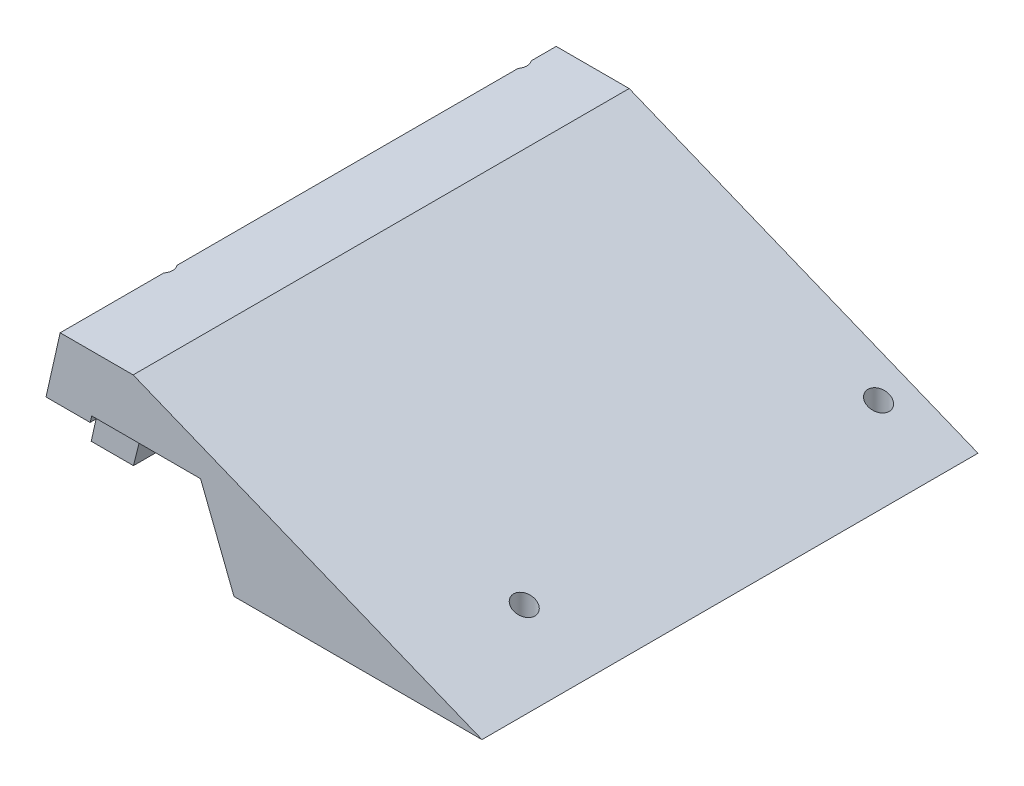
ISO-10303-21;
HEADER;
FILE_DESCRIPTION(('STEP AP214'),'2;1');
FILE_NAME('part.step','',(''),(''),'','','');
FILE_SCHEMA(('AUTOMOTIVE_DESIGN { 1 0 10303 214 1 1 1 1 }'));
ENDSEC;
DATA;
#1=APPLICATION_CONTEXT('core data for automotive mechanical design processes');
#2=APPLICATION_PROTOCOL_DEFINITION('international standard','automotive_design',2000,#1);
#3=PRODUCT_CONTEXT('',#1,'mechanical');
#4=PRODUCT('Part','Part','',(#3));
#5=PRODUCT_RELATED_PRODUCT_CATEGORY('part','',(#4));
#6=PRODUCT_DEFINITION_FORMATION('','',#4);
#7=PRODUCT_DEFINITION_CONTEXT('part definition',#1,'design');
#8=PRODUCT_DEFINITION('design','',#6,#7);
#9=PRODUCT_DEFINITION_SHAPE('','',#8);
#10=(LENGTH_UNIT() NAMED_UNIT(*) SI_UNIT(.MILLI.,.METRE.));
#11=(NAMED_UNIT(*) PLANE_ANGLE_UNIT() SI_UNIT($,.RADIAN.));
#12=(NAMED_UNIT(*) SI_UNIT($,.STERADIAN.) SOLID_ANGLE_UNIT());
#13=UNCERTAINTY_MEASURE_WITH_UNIT(LENGTH_MEASURE(1.E-05),#10,'distance_accuracy_value','');
#14=(GEOMETRIC_REPRESENTATION_CONTEXT(3) GLOBAL_UNCERTAINTY_ASSIGNED_CONTEXT((#13)) GLOBAL_UNIT_ASSIGNED_CONTEXT((#10,
#11,#12)) REPRESENTATION_CONTEXT('',''));
#15=CARTESIAN_POINT('',(0.,0.,0.));
#16=DIRECTION('',(0.,0.,1.));
#17=DIRECTION('',(1.,0.,0.));
#18=AXIS2_PLACEMENT_3D('',#15,#16,#17);
#19=CARTESIAN_POINT('',(13.4332721150903,10.8252450173548,63.));
#20=DIRECTION('',(-0.970371375639122,0.241618280227795,0.));
#21=DIRECTION('',(-0.241618280227795,-0.970371375639122,0.));
#22=AXIS2_PLACEMENT_3D('',#19,#20,#21);
#23=PLANE('',#22);
#24=DIRECTION('',(0.241618280227795,0.970371375639122,0.));
#25=VECTOR('',#24,1.);
#26=CARTESIAN_POINT('',(13.4332721150903,10.8252450173548,55.));
#27=LINE('',#26,#25);
#28=CARTESIAN_POINT('',(10.7378328741965,0.,55.));
#29=VERTEX_POINT('',#28);
#30=CARTESIAN_POINT('',(13.2277896710843,10.,55.));
#31=VERTEX_POINT('',#30);
#32=EDGE_CURVE('E200',#29,#31,#27,.T.);
#33=ORIENTED_EDGE('',*,*,#32,.F.);
#34=DIRECTION('',(0.,0.,-1.));
#35=VECTOR('',#34,1.);
#36=CARTESIAN_POINT('',(10.7378328741965,0.,63.));
#37=LINE('',#36,#35);
#38=CARTESIAN_POINT('',(10.7378328741965,0.,6.));
#39=VERTEX_POINT('',#38);
#40=EDGE_CURVE('E153',#29,#39,#37,.T.);
#41=ORIENTED_EDGE('',*,*,#40,.T.);
#42=DIRECTION('',(0.241618280227795,0.970371375639122,0.));
#43=VECTOR('',#42,1.);
#44=CARTESIAN_POINT('',(13.4332721150903,10.8252450173548,6.));
#45=LINE('',#44,#43);
#46=CARTESIAN_POINT('',(13.4332721150903,10.8252450173548,6.));
#47=VERTEX_POINT('',#46);
#48=EDGE_CURVE('E205',#39,#47,#45,.T.);
#49=ORIENTED_EDGE('',*,*,#48,.T.);
#50=DIRECTION('',(0.,0.,-1.));
#51=VECTOR('',#50,1.);
#52=CARTESIAN_POINT('',(13.4332721150903,10.8252450173548,63.));
#53=LINE('',#52,#51);
#54=CARTESIAN_POINT('',(13.4332721150903,10.8252450173548,63.));
#55=VERTEX_POINT('',#54);
#56=EDGE_CURVE('E229',#55,#47,#53,.T.);
#57=ORIENTED_EDGE('',*,*,#56,.F.);
#58=DIRECTION('',(0.241618280227795,0.970371375639122,0.));
#59=VECTOR('',#58,1.);
#60=CARTESIAN_POINT('',(13.4332721150903,10.8252450173548,63.));
#61=LINE('',#60,#59);
#62=CARTESIAN_POINT('',(13.2277896710843,10.,63.));
#63=VERTEX_POINT('',#62);
#64=EDGE_CURVE('E227',#63,#55,#61,.T.);
#65=ORIENTED_EDGE('',*,*,#64,.F.);
#66=DIRECTION('',(0.,0.,1.));
#67=VECTOR('',#66,1.);
#68=CARTESIAN_POINT('',(13.2277896710843,10.,63.));
#69=LINE('',#68,#67);
#70=EDGE_CURVE('E196',#31,#63,#69,.T.);
#71=ORIENTED_EDGE('',*,*,#70,.F.);
#72=EDGE_LOOP('',(#33,#41,#49,#57,#65,#71));
#73=FACE_BOUND('',#72,.T.);
#74=ADVANCED_FACE('F44',(#73),#23,.F.);
#75=CARTESIAN_POINT('',(9.42653810835628,17.9645165202627,63.));
#76=DIRECTION('',(0.975427958578046,-0.220318627501776,0.));
#77=DIRECTION('',(0.220318627501776,0.975427958578046,0.));
#78=AXIS2_PLACEMENT_3D('',#75,#76,#77);
#79=PLANE('',#78);
#80=DIRECTION('',(0.,0.,-1.));
#81=VECTOR('',#80,1.);
#82=CARTESIAN_POINT('',(9.42653810835628,17.9645165202627,63.));
#83=LINE('',#82,#81);
#84=CARTESIAN_POINT('',(9.42653810835628,17.9645165202627,48.1609908221686));
#85=VERTEX_POINT('',#84);
#86=CARTESIAN_POINT('',(9.42653810835628,17.9645165202627,4.83900917783143));
#87=VERTEX_POINT('',#86);
#88=EDGE_CURVE('E141',#85,#87,#83,.T.);
#89=ORIENTED_EDGE('',*,*,#88,.T.);
#90=CARTESIAN_POINT('',(8.36891643709825,13.2820538549812,4.));
#91=DIRECTION('',(0.975427958578046,-0.220318627501776,0.));
#92=DIRECTION('',(-0.220318627501776,-0.975427958578046,0.));
#93=AXIS2_PLACEMENT_3D('',#90,#91,#92);
#94=ELLIPSE('',#93,6.12748915199699,1.35);
#95=CARTESIAN_POINT('',(9.42653810835628,17.9645165202627,3.16099082216857));
#96=VERTEX_POINT('',#95);
#97=EDGE_CURVE('E60',#87,#96,#94,.T.);
#98=ORIENTED_EDGE('',*,*,#97,.T.);
#99=CARTESIAN_POINT('',(9.42653810835628,17.9645165202627,0.));
#100=VERTEX_POINT('',#99);
#101=EDGE_CURVE('E139',#96,#100,#83,.T.);
#102=ORIENTED_EDGE('',*,*,#101,.T.);
#103=DIRECTION('',(-0.220318627501776,-0.975427958578046,0.));
#104=VECTOR('',#103,1.);
#105=CARTESIAN_POINT('',(9.42653810835628,17.9645165202627,0.));
#106=LINE('',#105,#104);
#107=CARTESIAN_POINT('',(5.36891643709825,0.,0.));
#108=VERTEX_POINT('',#107);
#109=EDGE_CURVE('E232',#100,#108,#106,.T.);
#110=ORIENTED_EDGE('',*,*,#109,.T.);
#111=DIRECTION('',(0.,0.,-1.));
#112=VECTOR('',#111,1.);
#113=CARTESIAN_POINT('',(5.36891643709825,0.,63.));
#114=LINE('',#113,#112);
#115=CARTESIAN_POINT('',(5.36891643709825,0.,55.));
#116=VERTEX_POINT('',#115);
#117=EDGE_CURVE('E150',#116,#108,#114,.T.);
#118=ORIENTED_EDGE('',*,*,#117,.F.);
#119=DIRECTION('',(-0.220318627501776,-0.975427958578046,0.));
#120=VECTOR('',#119,1.);
#121=CARTESIAN_POINT('',(9.42653810835628,17.9645165202627,55.));
#122=LINE('',#121,#120);
#123=CARTESIAN_POINT('',(7.62760325824444,10.,55.));
#124=VERTEX_POINT('',#123);
#125=EDGE_CURVE('E198',#124,#116,#122,.T.);
#126=ORIENTED_EDGE('',*,*,#125,.F.);
#127=DIRECTION('',(0.,0.,-1.));
#128=VECTOR('',#127,1.);
#129=CARTESIAN_POINT('',(7.62760325824444,10.,63.));
#130=LINE('',#129,#128);
#131=CARTESIAN_POINT('',(7.62760325824444,10.,63.));
#132=VERTEX_POINT('',#131);
#133=EDGE_CURVE('E194',#132,#124,#130,.T.);
#134=ORIENTED_EDGE('',*,*,#133,.F.);
#135=DIRECTION('',(-0.220318627501776,-0.975427958578046,0.));
#136=VECTOR('',#135,1.);
#137=CARTESIAN_POINT('',(9.42653810835628,17.9645165202627,63.));
#138=LINE('',#137,#136);
#139=CARTESIAN_POINT('',(9.42653810835628,17.9645165202627,63.));
#140=VERTEX_POINT('',#139);
#141=EDGE_CURVE('E224',#140,#132,#138,.T.);
#142=ORIENTED_EDGE('',*,*,#141,.F.);
#143=CARTESIAN_POINT('',(9.42653810835628,17.9645165202627,49.8390091778314));
#144=VERTEX_POINT('',#143);
#145=EDGE_CURVE('E152',#140,#144,#83,.T.);
#146=ORIENTED_EDGE('',*,*,#145,.T.);
#147=CARTESIAN_POINT('',(8.36891643709825,13.2820538549812,49.));
#148=DIRECTION('',(0.975427958578046,-0.220318627501776,0.));
#149=DIRECTION('',(-0.220318627501776,-0.975427958578046,0.));
#150=AXIS2_PLACEMENT_3D('',#147,#148,#149);
#151=ELLIPSE('',#150,6.12748915199699,1.35);
#152=EDGE_CURVE('E66',#144,#85,#151,.T.);
#153=ORIENTED_EDGE('',*,*,#152,.T.);
#154=EDGE_LOOP('',(#89,#98,#102,#110,#118,#126,#134,#142,#146,#153));
#155=FACE_BOUND('',#154,.T.);
#156=ADVANCED_FACE('F137',(#155),#79,.F.);
#157=CARTESIAN_POINT('',(5.36891643709825,0.,63.));
#158=DIRECTION('',(0.,1.,0.));
#159=DIRECTION('',(0.,0.,1.));
#160=AXIS2_PLACEMENT_3D('',#157,#158,#159);
#161=PLANE('',#160);
#162=CARTESIAN_POINT('',(54.3689164370982,0.,49.));
#163=DIRECTION('',(0.,-1.,0.));
#164=DIRECTION('',(0.,0.,-1.));
#165=AXIS2_PLACEMENT_3D('',#162,#163,#164);
#166=CIRCLE('',#165,1.35);
#167=CARTESIAN_POINT('',(54.3689164370982,0.,47.65));
#168=VERTEX_POINT('',#167);
#169=EDGE_CURVE('E143',#168,#168,#166,.T.);
#170=ORIENTED_EDGE('',*,*,#169,.F.);
#171=EDGE_LOOP('',(#170));
#172=FACE_BOUND('',#171,.T.);
#173=CARTESIAN_POINT('',(54.3689164370982,0.,4.));
#174=DIRECTION('',(0.,-1.,0.));
#175=DIRECTION('',(0.,0.,-1.));
#176=AXIS2_PLACEMENT_3D('',#173,#174,#175);
#177=CIRCLE('',#176,1.35);
#178=CARTESIAN_POINT('',(54.3689164370982,0.,2.65));
#179=VERTEX_POINT('',#178);
#180=EDGE_CURVE('E388',#179,#179,#177,.T.);
#181=ORIENTED_EDGE('',*,*,#180,.F.);
#182=EDGE_LOOP('',(#181));
#183=FACE_BOUND('',#182,.T.);
#184=CARTESIAN_POINT('',(8.36891643709825,0.,4.));
#185=DIRECTION('',(0.,-1.,0.));
#186=DIRECTION('',(0.,0.,-1.));
#187=AXIS2_PLACEMENT_3D('',#184,#185,#186);
#188=CIRCLE('',#187,1.35);
#189=CARTESIAN_POINT('',(8.36891643709825,0.,2.65));
#190=VERTEX_POINT('',#189);
#191=EDGE_CURVE('E391',#190,#190,#188,.T.);
#192=ORIENTED_EDGE('',*,*,#191,.F.);
#193=EDGE_LOOP('',(#192));
#194=FACE_BOUND('',#193,.T.);
#195=CARTESIAN_POINT('',(8.36891643709825,0.,49.));
#196=DIRECTION('',(0.,-1.,0.));
#197=DIRECTION('',(0.,0.,-1.));
#198=AXIS2_PLACEMENT_3D('',#195,#196,#197);
#199=CIRCLE('',#198,1.35);
#200=CARTESIAN_POINT('',(8.36891643709825,0.,47.65));
#201=VERTEX_POINT('',#200);
#202=EDGE_CURVE('E178',#201,#201,#199,.T.);
#203=ORIENTED_EDGE('',*,*,#202,.F.);
#204=EDGE_LOOP('',(#203));
#205=FACE_BOUND('',#204,.T.);
#206=DIRECTION('',(-1.,0.,0.));
#207=VECTOR('',#206,1.);
#208=CARTESIAN_POINT('',(17.,0.,55.));
#209=LINE('',#208,#207);
#210=EDGE_CURVE('E191',#29,#116,#209,.T.);
#211=ORIENTED_EDGE('',*,*,#210,.T.);
#212=ORIENTED_EDGE('',*,*,#117,.T.);
#213=DIRECTION('',(1.,0.,0.));
#214=VECTOR('',#213,1.);
#215=CARTESIAN_POINT('',(5.36891643709825,0.,0.));
#216=LINE('',#215,#214);
#217=CARTESIAN_POINT('',(63.,0.,0.));
#218=VERTEX_POINT('',#217);
#219=EDGE_CURVE('E216',#108,#218,#216,.T.);
#220=ORIENTED_EDGE('',*,*,#219,.T.);
#221=DIRECTION('',(0.,0.,-1.));
#222=VECTOR('',#221,1.);
#223=CARTESIAN_POINT('',(63.,0.,63.));
#224=LINE('',#223,#222);
#225=CARTESIAN_POINT('',(63.,0.,63.));
#226=VERTEX_POINT('',#225);
#227=EDGE_CURVE('E160',#226,#218,#224,.T.);
#228=ORIENTED_EDGE('',*,*,#227,.F.);
#229=DIRECTION('',(1.,0.,0.));
#230=VECTOR('',#229,1.);
#231=CARTESIAN_POINT('',(31.5,0.,63.));
#232=LINE('',#231,#230);
#233=CARTESIAN_POINT('',(31.5,0.,63.));
#234=VERTEX_POINT('',#233);
#235=EDGE_CURVE('E218',#234,#226,#232,.T.);
#236=ORIENTED_EDGE('',*,*,#235,.F.);
#237=DIRECTION('',(0.,0.,-1.));
#238=VECTOR('',#237,1.);
#239=CARTESIAN_POINT('',(31.5,0.,63.));
#240=LINE('',#239,#238);
#241=CARTESIAN_POINT('',(31.5,0.,6.));
#242=VERTEX_POINT('',#241);
#243=EDGE_CURVE('E164',#234,#242,#240,.T.);
#244=ORIENTED_EDGE('',*,*,#243,.T.);
#245=DIRECTION('',(-1.,0.,0.));
#246=VECTOR('',#245,1.);
#247=CARTESIAN_POINT('',(10.7378328741965,0.,6.));
#248=LINE('',#247,#246);
#249=EDGE_CURVE('E202',#242,#39,#248,.T.);
#250=ORIENTED_EDGE('',*,*,#249,.T.);
#251=ORIENTED_EDGE('',*,*,#40,.F.);
#252=EDGE_LOOP('',(#211,#212,#220,#228,#236,#244,#250,#251));
#253=FACE_BOUND('',#252,.T.);
#254=ADVANCED_FACE('F249',(#172,#183,#194,#205,#253),#161,.F.);
#255=CARTESIAN_POINT('',(0.,0.,63.));
#256=DIRECTION('',(0.,0.,-1.));
#257=DIRECTION('',(-1.,0.,0.));
#258=AXIS2_PLACEMENT_3D('',#255,#256,#257);
#259=PLANE('',#258);
#260=DIRECTION('',(-1.,0.,0.));
#261=VECTOR('',#260,1.);
#262=CARTESIAN_POINT('',(0.,10.,63.));
#263=LINE('',#262,#261);
#264=EDGE_CURVE('E172',#63,#132,#263,.T.);
#265=ORIENTED_EDGE('',*,*,#264,.F.);
#266=ORIENTED_EDGE('',*,*,#64,.T.);
#267=DIRECTION('',(1.,0.,0.));
#268=VECTOR('',#267,1.);
#269=CARTESIAN_POINT('',(13.4332721150903,10.8252450173548,63.));
#270=LINE('',#269,#268);
#271=CARTESIAN_POINT('',(27.2620064049157,10.8252450173548,63.));
#272=VERTEX_POINT('',#271);
#273=EDGE_CURVE('E212',#55,#272,#270,.T.);
#274=ORIENTED_EDGE('',*,*,#273,.T.);
#275=DIRECTION('',(0.364550638650222,-0.93118356507174,0.));
#276=VECTOR('',#275,1.);
#277=CARTESIAN_POINT('',(27.2620064049157,10.8252450173548,63.));
#278=LINE('',#277,#276);
#279=EDGE_CURVE('E215',#272,#234,#278,.T.);
#280=ORIENTED_EDGE('',*,*,#279,.T.);
#281=ORIENTED_EDGE('',*,*,#235,.T.);
#282=DIRECTION('',(-0.926713780591244,0.375767972108166,0.));
#283=VECTOR('',#282,1.);
#284=CARTESIAN_POINT('',(63.,0.,63.));
#285=LINE('',#284,#283);
#286=CARTESIAN_POINT('',(18.6961575847282,17.9645165202627,63.));
#287=VERTEX_POINT('',#286);
#288=EDGE_CURVE('E220',#226,#287,#285,.T.);
#289=ORIENTED_EDGE('',*,*,#288,.T.);
#290=DIRECTION('',(-1.,0.,0.));
#291=VECTOR('',#290,1.);
#292=CARTESIAN_POINT('',(18.6961575847282,17.9645165202627,63.));
#293=LINE('',#292,#291);
#294=EDGE_CURVE('E222',#287,#140,#293,.T.);
#295=ORIENTED_EDGE('',*,*,#294,.T.);
#296=ORIENTED_EDGE('',*,*,#141,.T.);
#297=EDGE_LOOP('',(#265,#266,#274,#280,#281,#289,#295,#296));
#298=FACE_BOUND('',#297,.T.);
#299=ADVANCED_FACE('F261',(#298),#259,.F.);
#300=CARTESIAN_POINT('',(13.4332721150903,10.8252450173548,63.));
#301=DIRECTION('',(0.,1.,0.));
#302=DIRECTION('',(0.,0.,1.));
#303=AXIS2_PLACEMENT_3D('',#300,#301,#302);
#304=PLANE('',#303);
#305=DIRECTION('',(1.,0.,0.));
#306=VECTOR('',#305,1.);
#307=CARTESIAN_POINT('',(27.2620064049157,10.8252450173548,6.));
#308=LINE('',#307,#306);
#309=CARTESIAN_POINT('',(27.2620064049157,10.8252450173548,6.));
#310=VERTEX_POINT('',#309);
#311=EDGE_CURVE('E207',#47,#310,#308,.T.);
#312=ORIENTED_EDGE('',*,*,#311,.T.);
#313=DIRECTION('',(0.,0.,-1.));
#314=VECTOR('',#313,1.);
#315=CARTESIAN_POINT('',(27.2620064049157,10.8252450173548,63.));
#316=LINE('',#315,#314);
#317=EDGE_CURVE('E169',#272,#310,#316,.T.);
#318=ORIENTED_EDGE('',*,*,#317,.F.);
#319=ORIENTED_EDGE('',*,*,#273,.F.);
#320=ORIENTED_EDGE('',*,*,#56,.T.);
#321=EDGE_LOOP('',(#312,#318,#319,#320));
#322=FACE_BOUND('',#321,.T.);
#323=ADVANCED_FACE('F46',(#322),#304,.F.);
#324=CARTESIAN_POINT('',(27.2620064049157,10.8252450173548,63.));
#325=DIRECTION('',(0.93118356507174,0.364550638650222,0.));
#326=DIRECTION('',(-0.364550638650222,0.93118356507174,0.));
#327=AXIS2_PLACEMENT_3D('',#324,#325,#326);
#328=PLANE('',#327);
#329=DIRECTION('',(0.364550638650222,-0.93118356507174,0.));
#330=VECTOR('',#329,1.);
#331=CARTESIAN_POINT('',(31.5,0.,6.));
#332=LINE('',#331,#330);
#333=EDGE_CURVE('E209',#310,#242,#332,.T.);
#334=ORIENTED_EDGE('',*,*,#333,.T.);
#335=ORIENTED_EDGE('',*,*,#243,.F.);
#336=ORIENTED_EDGE('',*,*,#279,.F.);
#337=ORIENTED_EDGE('',*,*,#317,.T.);
#338=EDGE_LOOP('',(#334,#335,#336,#337));
#339=FACE_BOUND('',#338,.T.);
#340=ADVANCED_FACE('F254',(#339),#328,.F.);
#341=CARTESIAN_POINT('',(63.,0.,63.));
#342=DIRECTION('',(-0.375767972108166,-0.926713780591244,0.));
#343=DIRECTION('',(0.926713780591244,-0.375767972108166,0.));
#344=AXIS2_PLACEMENT_3D('',#341,#342,#343);
#345=PLANE('',#344);
#346=CARTESIAN_POINT('',(54.3689164370982,3.49976965429229,49.));
#347=DIRECTION('',(-0.375767972108166,-0.926713780591244,0.));
#348=DIRECTION('',(0.926713780591244,-0.375767972108166,0.));
#349=AXIS2_PLACEMENT_3D('',#346,#347,#348);
#350=ELLIPSE('',#349,1.45676046722721,1.35);
#351=CARTESIAN_POINT('',(55.7189164370982,2.95236572767498,49.));
#352=VERTEX_POINT('',#351);
#353=EDGE_CURVE('E48',#352,#352,#350,.T.);
#354=ORIENTED_EDGE('',*,*,#353,.T.);
#355=EDGE_LOOP('',(#354));
#356=FACE_BOUND('',#355,.T.);
#357=CARTESIAN_POINT('',(54.3689164370982,3.49976965429229,4.));
#358=DIRECTION('',(-0.375767972108166,-0.926713780591244,0.));
#359=DIRECTION('',(0.926713780591244,-0.375767972108166,0.));
#360=AXIS2_PLACEMENT_3D('',#357,#358,#359);
#361=ELLIPSE('',#360,1.45676046722721,1.35);
#362=CARTESIAN_POINT('',(55.7189164370982,2.95236572767498,4.));
#363=VERTEX_POINT('',#362);
#364=EDGE_CURVE('E142',#363,#363,#361,.T.);
#365=ORIENTED_EDGE('',*,*,#364,.T.);
#366=EDGE_LOOP('',(#365));
#367=FACE_BOUND('',#366,.T.);
#368=DIRECTION('',(-0.926713780591244,0.375767972108166,0.));
#369=VECTOR('',#368,1.);
#370=CARTESIAN_POINT('',(63.,0.,0.));
#371=LINE('',#370,#369);
#372=CARTESIAN_POINT('',(18.6961575847282,17.9645165202627,0.));
#373=VERTEX_POINT('',#372);
#374=EDGE_CURVE('E211',#218,#373,#371,.T.);
#375=ORIENTED_EDGE('',*,*,#374,.T.);
#376=DIRECTION('',(0.,0.,-1.));
#377=VECTOR('',#376,1.);
#378=CARTESIAN_POINT('',(18.6961575847282,17.9645165202627,63.));
#379=LINE('',#378,#377);
#380=EDGE_CURVE('E157',#287,#373,#379,.T.);
#381=ORIENTED_EDGE('',*,*,#380,.F.);
#382=ORIENTED_EDGE('',*,*,#288,.F.);
#383=ORIENTED_EDGE('',*,*,#227,.T.);
#384=EDGE_LOOP('',(#375,#381,#382,#383));
#385=FACE_BOUND('',#384,.T.);
#386=ADVANCED_FACE('F275',(#356,#367,#385),#345,.F.);
#387=CARTESIAN_POINT('',(18.6961575847282,17.9645165202627,63.));
#388=DIRECTION('',(0.,-1.,0.));
#389=DIRECTION('',(1.,0.,0.));
#390=AXIS2_PLACEMENT_3D('',#387,#388,#389);
#391=PLANE('',#390);
#392=ORIENTED_EDGE('',*,*,#101,.F.);
#393=CARTESIAN_POINT('',(8.36891643709825,17.9645165202627,4.));
#394=DIRECTION('',(0.,-1.,0.));
#395=DIRECTION('',(1.,0.,0.));
#396=AXIS2_PLACEMENT_3D('',#393,#394,#395);
#397=CIRCLE('',#396,1.35);
#398=EDGE_CURVE('E13',#96,#87,#397,.T.);
#399=ORIENTED_EDGE('',*,*,#398,.T.);
#400=ORIENTED_EDGE('',*,*,#88,.F.);
#401=CARTESIAN_POINT('',(8.36891643709825,17.9645165202627,49.));
#402=DIRECTION('',(0.,-1.,0.));
#403=DIRECTION('',(1.,0.,0.));
#404=AXIS2_PLACEMENT_3D('',#401,#402,#403);
#405=CIRCLE('',#404,1.35);
#406=EDGE_CURVE('E53',#85,#144,#405,.T.);
#407=ORIENTED_EDGE('',*,*,#406,.T.);
#408=ORIENTED_EDGE('',*,*,#145,.F.);
#409=ORIENTED_EDGE('',*,*,#294,.F.);
#410=ORIENTED_EDGE('',*,*,#380,.T.);
#411=DIRECTION('',(-1.,0.,0.));
#412=VECTOR('',#411,1.);
#413=CARTESIAN_POINT('',(18.6961575847282,17.9645165202627,0.));
#414=LINE('',#413,#412);
#415=EDGE_CURVE('E148',#373,#100,#414,.T.);
#416=ORIENTED_EDGE('',*,*,#415,.T.);
#417=EDGE_LOOP('',(#392,#399,#400,#407,#408,#409,#410,#416));
#418=FACE_BOUND('',#417,.T.);
#419=ADVANCED_FACE('F145',(#418),#391,.F.);
#420=CARTESIAN_POINT('',(0.,0.,0.));
#421=DIRECTION('',(0.,0.,-1.));
#422=DIRECTION('',(-1.,0.,0.));
#423=AXIS2_PLACEMENT_3D('',#420,#421,#422);
#424=PLANE('',#423);
#425=ORIENTED_EDGE('',*,*,#374,.F.);
#426=ORIENTED_EDGE('',*,*,#219,.F.);
#427=ORIENTED_EDGE('',*,*,#109,.F.);
#428=ORIENTED_EDGE('',*,*,#415,.F.);
#429=EDGE_LOOP('',(#425,#426,#427,#428));
#430=FACE_BOUND('',#429,.T.);
#431=ADVANCED_FACE('F273',(#430),#424,.T.);
#432=CARTESIAN_POINT('',(0.,0.,6.));
#433=DIRECTION('',(0.,0.,-1.));
#434=DIRECTION('',(-1.,0.,0.));
#435=AXIS2_PLACEMENT_3D('',#432,#433,#434);
#436=PLANE('',#435);
#437=ORIENTED_EDGE('',*,*,#249,.F.);
#438=ORIENTED_EDGE('',*,*,#333,.F.);
#439=ORIENTED_EDGE('',*,*,#311,.F.);
#440=ORIENTED_EDGE('',*,*,#48,.F.);
#441=EDGE_LOOP('',(#437,#438,#439,#440));
#442=FACE_BOUND('',#441,.T.);
#443=ADVANCED_FACE('F247',(#442),#436,.F.);
#444=CARTESIAN_POINT('',(17.,10.,55.));
#445=DIRECTION('',(0.,0.,1.));
#446=DIRECTION('',(1.,0.,0.));
#447=AXIS2_PLACEMENT_3D('',#444,#445,#446);
#448=PLANE('',#447);
#449=ORIENTED_EDGE('',*,*,#32,.T.);
#450=DIRECTION('',(-1.,0.,0.));
#451=VECTOR('',#450,1.);
#452=CARTESIAN_POINT('',(17.,10.,55.));
#453=LINE('',#452,#451);
#454=EDGE_CURVE('E185',#31,#124,#453,.T.);
#455=ORIENTED_EDGE('',*,*,#454,.T.);
#456=ORIENTED_EDGE('',*,*,#125,.T.);
#457=ORIENTED_EDGE('',*,*,#210,.F.);
#458=EDGE_LOOP('',(#449,#455,#456,#457));
#459=FACE_BOUND('',#458,.T.);
#460=ADVANCED_FACE('F269',(#459),#448,.T.);
#461=CARTESIAN_POINT('',(17.,10.,63.));
#462=DIRECTION('',(0.,-1.,0.));
#463=DIRECTION('',(0.,0.,-1.));
#464=AXIS2_PLACEMENT_3D('',#461,#462,#463);
#465=PLANE('',#464);
#466=ORIENTED_EDGE('',*,*,#70,.T.);
#467=ORIENTED_EDGE('',*,*,#264,.T.);
#468=ORIENTED_EDGE('',*,*,#133,.T.);
#469=ORIENTED_EDGE('',*,*,#454,.F.);
#470=EDGE_LOOP('',(#466,#467,#468,#469));
#471=FACE_BOUND('',#470,.T.);
#472=ADVANCED_FACE('F264',(#471),#465,.T.);
#473=CARTESIAN_POINT('',(8.36891643709825,34.,49.));
#474=DIRECTION('',(0.,-1.,0.));
#475=DIRECTION('',(0.,0.,-1.));
#476=AXIS2_PLACEMENT_3D('',#473,#474,#475);
#477=CYLINDRICAL_SURFACE('',#476,1.35);
#478=ORIENTED_EDGE('',*,*,#202,.T.);
#479=EDGE_LOOP('',(#478));
#480=FACE_BOUND('',#479,.T.);
#481=ORIENTED_EDGE('',*,*,#406,.F.);
#482=ORIENTED_EDGE('',*,*,#152,.F.);
#483=EDGE_LOOP('',(#481,#482));
#484=FACE_BOUND('',#483,.T.);
#485=ADVANCED_FACE('F277',(#480,#484),#477,.F.);
#486=CARTESIAN_POINT('',(8.36891643709825,34.,4.));
#487=DIRECTION('',(0.,-1.,0.));
#488=DIRECTION('',(0.,0.,-1.));
#489=AXIS2_PLACEMENT_3D('',#486,#487,#488);
#490=CYLINDRICAL_SURFACE('',#489,1.35);
#491=ORIENTED_EDGE('',*,*,#191,.T.);
#492=EDGE_LOOP('',(#491));
#493=FACE_BOUND('',#492,.T.);
#494=ORIENTED_EDGE('',*,*,#398,.F.);
#495=ORIENTED_EDGE('',*,*,#97,.F.);
#496=EDGE_LOOP('',(#494,#495));
#497=FACE_BOUND('',#496,.T.);
#498=ADVANCED_FACE('F131',(#493,#497),#490,.F.);
#499=CARTESIAN_POINT('',(54.3689164370982,34.,4.));
#500=DIRECTION('',(0.,-1.,0.));
#501=DIRECTION('',(0.,0.,-1.));
#502=AXIS2_PLACEMENT_3D('',#499,#500,#501);
#503=CYLINDRICAL_SURFACE('',#502,1.35);
#504=ORIENTED_EDGE('',*,*,#180,.T.);
#505=EDGE_LOOP('',(#504));
#506=FACE_BOUND('',#505,.T.);
#507=ORIENTED_EDGE('',*,*,#364,.F.);
#508=EDGE_LOOP('',(#507));
#509=FACE_BOUND('',#508,.T.);
#510=ADVANCED_FACE('F284',(#506,#509),#503,.F.);
#511=CARTESIAN_POINT('',(54.3689164370982,34.,49.));
#512=DIRECTION('',(0.,-1.,0.));
#513=DIRECTION('',(0.,0.,-1.));
#514=AXIS2_PLACEMENT_3D('',#511,#512,#513);
#515=CYLINDRICAL_SURFACE('',#514,1.35);
#516=ORIENTED_EDGE('',*,*,#169,.T.);
#517=EDGE_LOOP('',(#516));
#518=FACE_BOUND('',#517,.T.);
#519=ORIENTED_EDGE('',*,*,#353,.F.);
#520=EDGE_LOOP('',(#519));
#521=FACE_BOUND('',#520,.T.);
#522=ADVANCED_FACE('F371',(#518,#521),#515,.F.);
#523=CLOSED_SHELL('',(#74,#156,#254,#299,#323,#340,#386,#419,#431,#443,#460,#472,#485,#498,#510,#522));
#524=MANIFOLD_SOLID_BREP('B2',#523);
#525=ADVANCED_BREP_SHAPE_REPRESENTATION('',(#18,#524),#14);
#526=SHAPE_DEFINITION_REPRESENTATION(#9,#525);
ENDSEC;
END-ISO-10303-21;
